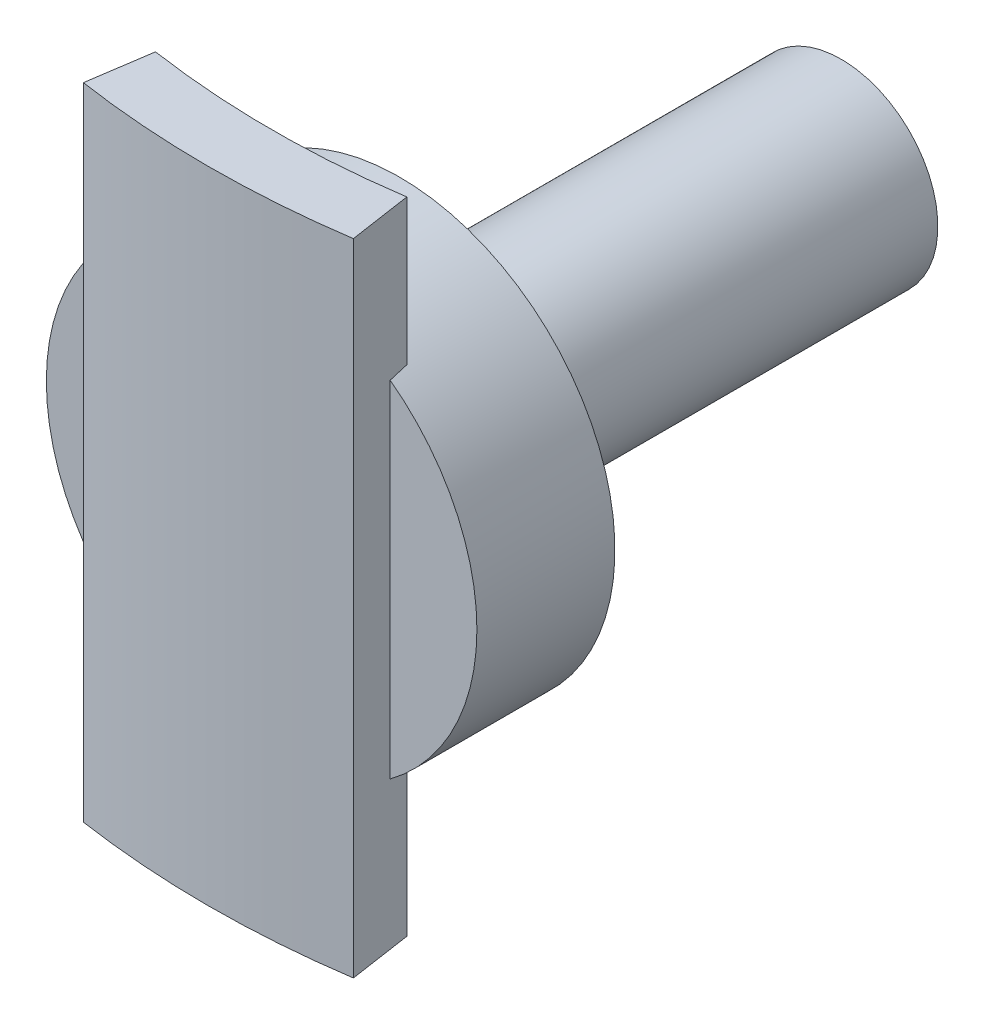
ISO-10303-21;
HEADER;
FILE_DESCRIPTION(('STEP AP214'),'2;1');
FILE_NAME('part.step','',(''),(''),'','','');
FILE_SCHEMA(('AUTOMOTIVE_DESIGN { 1 0 10303 214 1 1 1 1 }'));
ENDSEC;
DATA;
#1=APPLICATION_CONTEXT('core data for automotive mechanical design processes');
#2=APPLICATION_PROTOCOL_DEFINITION('international standard','automotive_design',2000,#1);
#3=PRODUCT_CONTEXT('',#1,'mechanical');
#4=PRODUCT('Part','Part','',(#3));
#5=PRODUCT_RELATED_PRODUCT_CATEGORY('part','',(#4));
#6=PRODUCT_DEFINITION_FORMATION('','',#4);
#7=PRODUCT_DEFINITION_CONTEXT('part definition',#1,'design');
#8=PRODUCT_DEFINITION('design','',#6,#7);
#9=PRODUCT_DEFINITION_SHAPE('','',#8);
#10=(LENGTH_UNIT() NAMED_UNIT(*) SI_UNIT(.MILLI.,.METRE.));
#11=(NAMED_UNIT(*) PLANE_ANGLE_UNIT() SI_UNIT($,.RADIAN.));
#12=(NAMED_UNIT(*) SI_UNIT($,.STERADIAN.) SOLID_ANGLE_UNIT());
#13=UNCERTAINTY_MEASURE_WITH_UNIT(LENGTH_MEASURE(1.E-05),#10,'distance_accuracy_value','');
#14=(GEOMETRIC_REPRESENTATION_CONTEXT(3) GLOBAL_UNCERTAINTY_ASSIGNED_CONTEXT((#13)) GLOBAL_UNIT_ASSIGNED_CONTEXT((#10,
#11,#12)) REPRESENTATION_CONTEXT('',''));
#15=CARTESIAN_POINT('',(0.,0.,0.));
#16=DIRECTION('',(0.,0.,1.));
#17=DIRECTION('',(1.,0.,0.));
#18=AXIS2_PLACEMENT_3D('',#15,#16,#17);
#19=CARTESIAN_POINT('',(0.,20.2,0.));
#20=DIRECTION('',(0.,-1.,0.));
#21=DIRECTION('',(0.,0.,-1.));
#22=AXIS2_PLACEMENT_3D('',#19,#20,#21);
#23=CYLINDRICAL_SURFACE('',#22,15.4);
#24=DIRECTION('',(0.,1.,0.));
#25=VECTOR('',#24,1.);
#26=CARTESIAN_POINT('',(-2.27626493139601,0.,15.2308442957735));
#27=LINE('',#26,#25);
#28=CARTESIAN_POINT('',(-2.27626493139601,21.9,15.2308442957735));
#29=VERTEX_POINT('',#28);
#30=CARTESIAN_POINT('',(-2.27626493139601,24.53320067543,15.2308442957735));
#31=VERTEX_POINT('',#30);
#32=EDGE_CURVE('E173',#29,#31,#27,.T.);
#33=ORIENTED_EDGE('',*,*,#32,.T.);
#34=CARTESIAN_POINT('',(-3.9,27.7,14.8979864411269));
#35=CARTESIAN_POINT('',(-3.89999405074988,27.4847386443197,14.8979904925009));
#36=CARTESIAN_POINT('',(-3.88211719420394,27.2694120222019,14.9027028737933));
#37=CARTESIAN_POINT('',(-3.81120018639779,26.844948940572,14.9209935374308));
#38=CARTESIAN_POINT('',(-3.7581401116938,26.6358160585698,14.9345768431095));
#39=CARTESIAN_POINT('',(-3.61868954621345,26.2299415941311,14.9689745230359));
#40=CARTESIAN_POINT('',(-3.53234280836113,26.033184138331,14.9897794014855));
#41=CARTESIAN_POINT('',(-3.32890398749788,25.6569247031427,15.0362641675388));
#42=CARTESIAN_POINT('',(-3.21181039035515,25.4774235741387,15.0619442952072));
#43=CARTESIAN_POINT('',(-2.94737744200514,25.136719763423,15.1159351982628));
#44=CARTESIAN_POINT('',(-2.79947072215102,24.9759641510205,15.1442888949249));
#45=CARTESIAN_POINT('',(-2.47883177445363,24.6812557943867,15.2000602125481));
#46=CARTESIAN_POINT('',(-2.30609718171597,24.5473056063256,15.2274777440296));
#47=CARTESIAN_POINT('',(-1.9376359377648,24.308174655996,15.2787631690267));
#48=CARTESIAN_POINT('',(-1.74161504775736,24.2034340881467,15.3025745099589));
#49=CARTESIAN_POINT('',(-1.33404464793704,24.0285593938372,15.3434744599586));
#50=CARTESIAN_POINT('',(-1.12249749667822,23.9584200236469,15.3605640876063));
#51=CARTESIAN_POINT('',(-0.69454145904559,23.8561735433245,15.3857916359705));
#52=CARTESIAN_POINT('',(-0.478324723144728,23.8233069864583,15.3941080583321));
#53=CARTESIAN_POINT('',(-0.0432972080128685,23.7941541883577,15.4014745886998));
#54=CARTESIAN_POINT('',(0.175513173050788,23.7978624031118,15.400526101083));
#55=CARTESIAN_POINT('',(0.604245976060564,23.841209843353,15.389602159303));
#56=CARTESIAN_POINT('',(0.814257334881429,23.8800291749485,15.3798326962527));
#57=CARTESIAN_POINT('',(1.2246823364494,23.9911777599147,15.3526049718664));
#58=CARTESIAN_POINT('',(1.42509546027114,24.0635088228346,15.3351462953349));
#59=CARTESIAN_POINT('',(1.81278229555946,24.2402843320468,15.2941885249762));
#60=CARTESIAN_POINT('',(1.99991795026964,24.3450184856472,15.2706352652444));
#61=CARTESIAN_POINT('',(2.35424352250207,24.5834069087999,15.2200399961182));
#62=CARTESIAN_POINT('',(2.52142988095994,24.7170663268469,15.1929973659868));
#63=CARTESIAN_POINT('',(2.83600167487867,25.0138983258875,15.1374815020119));
#64=CARTESIAN_POINT('',(2.98270868902013,25.1777871243347,15.1089893939195));
#65=CARTESIAN_POINT('',(3.24671079486308,25.5281386438389,15.0544708338493));
#66=CARTESIAN_POINT('',(3.3640044370201,25.7146024767635,15.0284445034288));
#67=CARTESIAN_POINT('',(3.56630001868724,26.1061683792964,14.9817351187305));
#68=CARTESIAN_POINT('',(3.65113465288917,26.3113604374552,14.9610799195554));
#69=CARTESIAN_POINT('',(3.7848904580346,26.7337445414732,14.9278064853642));
#70=CARTESIAN_POINT('',(3.83381954290839,26.9509339316497,14.9151864793951));
#71=CARTESIAN_POINT('',(3.89324141105126,27.3848457722709,14.8997850833352));
#72=CARTESIAN_POINT('',(3.90473897637376,27.60142165733,14.89674656723));
#73=CARTESIAN_POINT('',(3.89172557400846,28.0333985212429,14.9001516021188));
#74=CARTESIAN_POINT('',(3.8672180177936,28.2487996094676,14.9065942547753));
#75=CARTESIAN_POINT('',(3.78377198997728,28.6685548741622,14.9279889299675));
#76=CARTESIAN_POINT('',(3.72542211416739,28.8730341921413,14.9427953749247));
#77=CARTESIAN_POINT('',(3.57660213074529,29.2693082245034,14.979110346047));
#78=CARTESIAN_POINT('',(3.48612814213297,29.4611014029171,15.0006196819681));
#79=CARTESIAN_POINT('',(3.27353714960041,29.8308059955084,15.0484556458607));
#80=CARTESIAN_POINT('',(3.15082144738989,30.0083614963358,15.0748703021819));
#81=CARTESIAN_POINT('',(2.87798464227016,30.3407290401364,15.1293263785643));
#82=CARTESIAN_POINT('',(2.7278589126258,30.4955372354546,15.157368072719));
#83=CARTESIAN_POINT('',(2.39984535026828,30.7821050651483,15.212792679267));
#84=CARTESIAN_POINT('',(2.22134218194987,30.9131685450769,15.2401400341939));
#85=CARTESIAN_POINT('',(1.84427886167081,31.1434616482568,15.2903484248145));
#86=CARTESIAN_POINT('',(1.64571976317756,31.2426929423985,15.3132096959609));
#87=CARTESIAN_POINT('',(1.23556096144038,31.4056326721255,15.3517250720794));
#88=CARTESIAN_POINT('',(1.0240687921994,31.4695988848094,15.3674313271498));
#89=CARTESIAN_POINT('',(0.592885188223482,31.5609620273279,15.39009555411));
#90=CARTESIAN_POINT('',(0.373195388970059,31.5883662118538,15.3970552614868));
#91=CARTESIAN_POINT('',(-0.0616142891208617,31.6054104091632,15.4013692655055));
#92=CARTESIAN_POINT('',(-0.276691954980204,31.5960765773344,15.3989845754779));
#93=CARTESIAN_POINT('',(-0.702108813803498,31.5422662074745,15.3854587207122));
#94=CARTESIAN_POINT('',(-0.912448154272103,31.4977907649653,15.3743178289442));
#95=CARTESIAN_POINT('',(-1.32131292245911,31.3755159177255,15.344573953277));
#96=CARTESIAN_POINT('',(-1.51989843697458,31.2979064022439,15.3260135282613));
#97=CARTESIAN_POINT('',(-1.90134176252194,31.1117380610176,15.2833823416124));
#98=CARTESIAN_POINT('',(-2.08419754214271,31.0031752456073,15.2593108697224));
#99=CARTESIAN_POINT('',(-2.43383985293489,30.7550764774223,15.2075130223074));
#100=CARTESIAN_POINT('',(-2.60012334907585,30.6148472789297,15.1797115921676));
#101=CARTESIAN_POINT('',(-2.90714674517715,30.3087363507427,15.1239181596848));
#102=CARTESIAN_POINT('',(-3.04788011504073,30.1428480831147,15.0959261105147));
#103=CARTESIAN_POINT('',(-3.30247621077681,29.7862789812087,15.0423051313605));
#104=CARTESIAN_POINT('',(-3.41576866813952,29.5951818730165,15.016732155676));
#105=CARTESIAN_POINT('',(-3.60845133503208,29.1960322803163,14.9716044644346));
#106=CARTESIAN_POINT('',(-3.68786574544259,28.9879920261405,14.9520454555816));
#107=CARTESIAN_POINT('',(-3.79898414980237,28.6003256990468,14.9241528812492));
#108=CARTESIAN_POINT('',(-3.83678133594134,28.4225229908735,14.9144153421253));
#109=CARTESIAN_POINT('',(-3.88729063795742,28.0631621122496,14.9013307016354));
#110=CARTESIAN_POINT('',(-3.90000501905832,27.88160428242,14.8979830232033));
#111=CARTESIAN_POINT('',(-3.9,27.7,14.8979864411269));
#112=B_SPLINE_CURVE_WITH_KNOTS('',3,(#34,#35,#36,#37,#38,#39,#40,#41,#42,#43,#44,#45,#46,#47,
#48,#49,#50,#51,#52,#53,#54,#55,#56,#57,#58,#59,#60,#61,#62,#63,#64,#65,#66,#67,#68,#69,#70,#71,
#72,#73,#74,#75,#76,#77,#78,#79,#80,#81,#82,#83,#84,#85,#86,#87,#88,#89,#90,#91,#92,#93,#94,#95,
#96,#97,#98,#99,#100,#101,#102,#103,#104,#105,#106,#107,#108,#109,#110,#111),.UNSPECIFIED.,.T.,
.F.,(4,2,2,2,2,2,2,2,2,2,2,2,2,2,2,2,2,2,2,2,2,2,2,2,2,2,2,2,2,2,2,2,2,2,2,2,2,2,4),(0.,
0.645116995748467,1.29059961868836,1.93523667824213,2.57990548895997,3.23770238460948,
3.89556197803203,4.56285721310402,5.23005129006042,5.88339203353123,6.53663374500011,
7.17500436063681,7.81340945069614,8.45769587901236,9.10209708026288,9.76438488565063,
10.4267053233745,11.0923950275429,11.7579379631578,12.4054615668901,13.0529238219396,
13.6894492218671,14.3260515483133,14.9754319911195,15.6249221490184,16.2911368144357,
16.9573165041225,17.6185597765126,18.2796718245205,18.922450735056,19.5652096080759,
20.2043333003772,20.8435394085559,21.4983953200688,22.1534183646455,22.821068008592,
23.4882399131782,24.0325391465382,24.576789222078),.UNSPECIFIED.);
#113=CARTESIAN_POINT('',(2.27626493139601,24.53320067543,15.2308442957735));
#114=VERTEX_POINT('',#113);
#115=EDGE_CURVE('E57',#31,#114,#112,.T.);
#116=ORIENTED_EDGE('',*,*,#115,.T.);
#117=DIRECTION('',(0.,1.,0.));
#118=VECTOR('',#117,1.);
#119=CARTESIAN_POINT('',(2.27626493139601,0.,15.2308442957735));
#120=LINE('',#119,#118);
#121=CARTESIAN_POINT('',(2.27626493139601,21.9,15.2308442957735));
#122=VERTEX_POINT('',#121);
#123=EDGE_CURVE('E157',#122,#114,#120,.T.);
#124=ORIENTED_EDGE('',*,*,#123,.F.);
#125=CARTESIAN_POINT('',(0.,21.9,0.));
#126=DIRECTION('',(0.,-1.,0.));
#127=DIRECTION('',(0.,0.,-1.));
#128=AXIS2_PLACEMENT_3D('',#125,#126,#127);
#129=CIRCLE('',#128,15.4);
#130=EDGE_CURVE('E139',#122,#29,#129,.T.);
#131=ORIENTED_EDGE('',*,*,#130,.T.);
#132=EDGE_LOOP('',(#33,#116,#124,#131));
#133=FACE_BOUND('',#132,.T.);
#134=ADVANCED_FACE('F41',(#133),#23,.F.);
#135=CARTESIAN_POINT('',(0.,20.2,0.));
#136=DIRECTION('',(0.,-1.,0.));
#137=DIRECTION('',(0.,0.,-1.));
#138=AXIS2_PLACEMENT_3D('',#135,#136,#137);
#139=CYLINDRICAL_SURFACE('',#138,16.55);
#140=CARTESIAN_POINT('',(0.,21.9,0.));
#141=DIRECTION('',(0.,-1.,0.));
#142=DIRECTION('',(0.,0.,-1.));
#143=AXIS2_PLACEMENT_3D('',#140,#141,#142);
#144=CIRCLE('',#143,16.55);
#145=CARTESIAN_POINT('',(2.44624575419506,21.9,16.3682125386397));
#146=VERTEX_POINT('',#145);
#147=CARTESIAN_POINT('',(-2.44624575419506,21.9,16.3682125386397));
#148=VERTEX_POINT('',#147);
#149=EDGE_CURVE('E135',#146,#148,#144,.T.);
#150=ORIENTED_EDGE('',*,*,#149,.F.);
#151=DIRECTION('',(0.,-1.,0.));
#152=VECTOR('',#151,1.);
#153=CARTESIAN_POINT('',(2.44624575419506,0.,16.3682125386397));
#154=LINE('',#153,#152);
#155=CARTESIAN_POINT('',(2.44624575419506,33.5,16.3682125386397));
#156=VERTEX_POINT('',#155);
#157=EDGE_CURVE('E166',#156,#146,#154,.T.);
#158=ORIENTED_EDGE('',*,*,#157,.F.);
#159=CARTESIAN_POINT('',(0.,33.5,0.));
#160=DIRECTION('',(0.,-1.,0.));
#161=DIRECTION('',(0.,0.,-1.));
#162=AXIS2_PLACEMENT_3D('',#159,#160,#161);
#163=CIRCLE('',#162,16.55);
#164=CARTESIAN_POINT('',(-2.44624575419506,33.5,16.3682125386397));
#165=VERTEX_POINT('',#164);
#166=EDGE_CURVE('E65',#156,#165,#163,.T.);
#167=ORIENTED_EDGE('',*,*,#166,.T.);
#168=DIRECTION('',(0.,-1.,0.));
#169=VECTOR('',#168,1.);
#170=CARTESIAN_POINT('',(-2.44624575419506,0.,16.3682125386397));
#171=LINE('',#170,#169);
#172=EDGE_CURVE('E179',#165,#148,#171,.T.);
#173=ORIENTED_EDGE('',*,*,#172,.T.);
#174=EDGE_LOOP('',(#150,#158,#167,#173));
#175=FACE_BOUND('',#174,.T.);
#176=ADVANCED_FACE('F217',(#175),#139,.T.);
#177=CARTESIAN_POINT('',(0.,21.9,0.));
#178=DIRECTION('',(0.,1.,0.));
#179=DIRECTION('',(0.,0.,1.));
#180=AXIS2_PLACEMENT_3D('',#177,#178,#179);
#181=PLANE('',#180);
#182=ORIENTED_EDGE('',*,*,#130,.F.);
#183=DIRECTION('',(-0.147809411129611,0.,-0.989015863361917));
#184=VECTOR('',#183,1.);
#185=CARTESIAN_POINT('',(0.,21.9,0.));
#186=LINE('',#185,#184);
#187=EDGE_CURVE('E162',#146,#122,#186,.T.);
#188=ORIENTED_EDGE('',*,*,#187,.F.);
#189=ORIENTED_EDGE('',*,*,#149,.T.);
#190=DIRECTION('',(0.147809411129611,0.,-0.989015863361917));
#191=VECTOR('',#190,1.);
#192=CARTESIAN_POINT('',(0.,21.9,0.));
#193=LINE('',#192,#191);
#194=EDGE_CURVE('E176',#148,#29,#193,.T.);
#195=ORIENTED_EDGE('',*,*,#194,.T.);
#196=EDGE_LOOP('',(#182,#188,#189,#195));
#197=FACE_BOUND('',#196,.T.);
#198=ADVANCED_FACE('F219',(#197),#181,.F.);
#199=CARTESIAN_POINT('',(2.27626493139601,30.8667993245699,15.2308442957735));
#200=VERTEX_POINT('',#199);
#201=CARTESIAN_POINT('',(2.27626493139601,33.5,15.2308442957735));
#202=VERTEX_POINT('',#201);
#203=EDGE_CURVE('E161',#200,#202,#120,.T.);
#204=ORIENTED_EDGE('',*,*,#203,.F.);
#205=CARTESIAN_POINT('',(-2.27626493139601,30.8667993245699,15.2308442957735));
#206=VERTEX_POINT('',#205);
#207=EDGE_CURVE('E189',#200,#206,#112,.T.);
#208=ORIENTED_EDGE('',*,*,#207,.T.);
#209=CARTESIAN_POINT('',(-2.27626493139601,33.5,15.2308442957735));
#210=VERTEX_POINT('',#209);
#211=EDGE_CURVE('E128',#206,#210,#27,.T.);
#212=ORIENTED_EDGE('',*,*,#211,.T.);
#213=CARTESIAN_POINT('',(0.,33.5,0.));
#214=DIRECTION('',(0.,-1.,0.));
#215=DIRECTION('',(0.,0.,-1.));
#216=AXIS2_PLACEMENT_3D('',#213,#214,#215);
#217=CIRCLE('',#216,15.4);
#218=EDGE_CURVE('E145',#202,#210,#217,.T.);
#219=ORIENTED_EDGE('',*,*,#218,.F.);
#220=EDGE_LOOP('',(#204,#208,#212,#219));
#221=FACE_BOUND('',#220,.T.);
#222=ADVANCED_FACE('F197',(#221),#23,.F.);
#223=CARTESIAN_POINT('',(0.,33.5,0.));
#224=DIRECTION('',(0.,-1.,0.));
#225=DIRECTION('',(0.,0.,-1.));
#226=AXIS2_PLACEMENT_3D('',#223,#224,#225);
#227=PLANE('',#226);
#228=DIRECTION('',(0.147809411129611,0.,0.989015863361917));
#229=VECTOR('',#228,1.);
#230=CARTESIAN_POINT('',(0.,33.5,0.));
#231=LINE('',#230,#229);
#232=EDGE_CURVE('E153',#202,#156,#231,.T.);
#233=ORIENTED_EDGE('',*,*,#232,.F.);
#234=ORIENTED_EDGE('',*,*,#218,.T.);
#235=DIRECTION('',(-0.147809411129611,0.,0.989015863361917));
#236=VECTOR('',#235,1.);
#237=CARTESIAN_POINT('',(0.,33.5,0.));
#238=LINE('',#237,#236);
#239=EDGE_CURVE('E170',#210,#165,#238,.T.);
#240=ORIENTED_EDGE('',*,*,#239,.T.);
#241=ORIENTED_EDGE('',*,*,#166,.F.);
#242=EDGE_LOOP('',(#233,#234,#240,#241));
#243=FACE_BOUND('',#242,.T.);
#244=ADVANCED_FACE('F215',(#243),#227,.F.);
#245=CARTESIAN_POINT('',(0.,0.,0.));
#246=DIRECTION('',(0.989015863361917,0.,-0.147809411129611));
#247=DIRECTION('',(-0.147809411129611,0.,-0.989015863361917));
#248=AXIS2_PLACEMENT_3D('',#245,#246,#247);
#249=PLANE('',#248);
#250=CARTESIAN_POINT('',(0.,27.7,0.));
#251=DIRECTION('',(0.989015863361917,0.,-0.147809411129611));
#252=DIRECTION('',(-0.147809411129611,0.,-0.989015863361917));
#253=AXIS2_PLACEMENT_3D('',#250,#251,#252);
#254=ELLIPSE('',#253,26.3853293927284,3.9);
#255=CARTESIAN_POINT('',(2.32913148884074,30.8281218818471,15.5845826914182));
#256=VERTEX_POINT('',#255);
#257=EDGE_CURVE('E185',#200,#256,#254,.T.);
#258=ORIENTED_EDGE('',*,*,#257,.F.);
#259=ORIENTED_EDGE('',*,*,#203,.T.);
#260=ORIENTED_EDGE('',*,*,#232,.T.);
#261=ORIENTED_EDGE('',*,*,#157,.T.);
#262=ORIENTED_EDGE('',*,*,#187,.T.);
#263=ORIENTED_EDGE('',*,*,#123,.T.);
#264=CARTESIAN_POINT('',(2.32913148884074,24.5718781181529,15.5845826914182));
#265=VERTEX_POINT('',#264);
#266=EDGE_CURVE('E186',#265,#114,#254,.T.);
#267=ORIENTED_EDGE('',*,*,#266,.F.);
#268=DIRECTION('',(0.,-1.,0.));
#269=VECTOR('',#268,1.);
#270=CARTESIAN_POINT('',(2.32913148884074,0.,15.5845826914182));
#271=LINE('',#270,#269);
#272=EDGE_CURVE('E182',#256,#265,#271,.T.);
#273=ORIENTED_EDGE('',*,*,#272,.F.);
#274=EDGE_LOOP('',(#258,#259,#260,#261,#262,#263,#267,#273));
#275=FACE_BOUND('',#274,.T.);
#276=ADVANCED_FACE('F212',(#275),#249,.T.);
#277=CARTESIAN_POINT('',(0.,0.,0.));
#278=DIRECTION('',(0.989015863361917,0.,0.147809411129611));
#279=DIRECTION('',(0.147809411129611,0.,-0.989015863361917));
#280=AXIS2_PLACEMENT_3D('',#277,#278,#279);
#281=PLANE('',#280);
#282=ORIENTED_EDGE('',*,*,#211,.F.);
#283=CARTESIAN_POINT('',(0.,27.7,0.));
#284=DIRECTION('',(0.989015863361917,0.,0.147809411129611));
#285=DIRECTION('',(0.147809411129611,0.,-0.989015863361917));
#286=AXIS2_PLACEMENT_3D('',#283,#284,#285);
#287=ELLIPSE('',#286,26.3853293927284,3.9);
#288=CARTESIAN_POINT('',(-2.32913148884074,30.8281218818471,15.5845826914182));
#289=VERTEX_POINT('',#288);
#290=EDGE_CURVE('E115',#206,#289,#287,.T.);
#291=ORIENTED_EDGE('',*,*,#290,.T.);
#292=DIRECTION('',(0.,-1.,0.));
#293=VECTOR('',#292,1.);
#294=CARTESIAN_POINT('',(-2.32913148884074,0.,15.5845826914182));
#295=LINE('',#294,#293);
#296=CARTESIAN_POINT('',(-2.32913148884074,24.5718781181529,15.5845826914182));
#297=VERTEX_POINT('',#296);
#298=EDGE_CURVE('E108',#289,#297,#295,.T.);
#299=ORIENTED_EDGE('',*,*,#298,.T.);
#300=EDGE_CURVE('E116',#297,#31,#287,.T.);
#301=ORIENTED_EDGE('',*,*,#300,.T.);
#302=ORIENTED_EDGE('',*,*,#32,.F.);
#303=ORIENTED_EDGE('',*,*,#194,.F.);
#304=ORIENTED_EDGE('',*,*,#172,.F.);
#305=ORIENTED_EDGE('',*,*,#239,.F.);
#306=EDGE_LOOP('',(#282,#291,#299,#301,#302,#303,#304,#305));
#307=FACE_BOUND('',#306,.T.);
#308=ADVANCED_FACE('F126',(#307),#281,.F.);
#309=CARTESIAN_POINT('',(0.,27.7,15.5845826914182));
#310=DIRECTION('',(0.,0.,1.));
#311=DIRECTION('',(1.,0.,0.));
#312=AXIS2_PLACEMENT_3D('',#309,#310,#311);
#313=PLANE('',#312);
#314=ORIENTED_EDGE('',*,*,#298,.F.);
#315=CARTESIAN_POINT('',(0.,27.7,15.5845826914182));
#316=DIRECTION('',(0.,0.,-1.));
#317=DIRECTION('',(-1.,0.,0.));
#318=AXIS2_PLACEMENT_3D('',#315,#316,#317);
#319=CIRCLE('',#318,3.9);
#320=EDGE_CURVE('E111',#297,#289,#319,.T.);
#321=ORIENTED_EDGE('',*,*,#320,.F.);
#322=EDGE_LOOP('',(#314,#321));
#323=FACE_BOUND('',#322,.T.);
#324=ADVANCED_FACE('F110',(#323),#313,.T.);
#325=EDGE_CURVE('E122',#256,#265,#319,.T.);
#326=ORIENTED_EDGE('',*,*,#325,.F.);
#327=ORIENTED_EDGE('',*,*,#272,.T.);
#328=EDGE_LOOP('',(#326,#327));
#329=FACE_BOUND('',#328,.T.);
#330=ADVANCED_FACE('F205',(#329),#313,.T.);
#331=CARTESIAN_POINT('',(0.,27.7,13.0845826914182));
#332=DIRECTION('',(0.,0.,-1.));
#333=DIRECTION('',(-1.,0.,0.));
#334=AXIS2_PLACEMENT_3D('',#331,#332,#333);
#335=CYLINDRICAL_SURFACE('',#334,3.9);
#336=ORIENTED_EDGE('',*,*,#207,.F.);
#337=ORIENTED_EDGE('',*,*,#257,.T.);
#338=ORIENTED_EDGE('',*,*,#325,.T.);
#339=ORIENTED_EDGE('',*,*,#266,.T.);
#340=ORIENTED_EDGE('',*,*,#115,.F.);
#341=ORIENTED_EDGE('',*,*,#300,.F.);
#342=ORIENTED_EDGE('',*,*,#320,.T.);
#343=ORIENTED_EDGE('',*,*,#290,.F.);
#344=EDGE_LOOP('',(#336,#337,#338,#339,#340,#341,#342,#343));
#345=FACE_BOUND('',#344,.T.);
#346=CARTESIAN_POINT('',(0.,27.7,13.0845826914182));
#347=DIRECTION('',(0.,0.,-1.));
#348=DIRECTION('',(-1.,0.,0.));
#349=AXIS2_PLACEMENT_3D('',#346,#347,#348);
#350=CIRCLE('',#349,3.9);
#351=CARTESIAN_POINT('',(-3.9,27.7,13.0845826914182));
#352=VERTEX_POINT('',#351);
#353=EDGE_CURVE('E123',#352,#352,#350,.T.);
#354=ORIENTED_EDGE('',*,*,#353,.F.);
#355=EDGE_LOOP('',(#354));
#356=FACE_BOUND('',#355,.T.);
#357=ADVANCED_FACE('F118',(#345,#356),#335,.T.);
#358=CARTESIAN_POINT('',(0.,31.6,13.0845826914182));
#359=DIRECTION('',(0.,0.,-1.));
#360=DIRECTION('',(-1.,0.,0.));
#361=AXIS2_PLACEMENT_3D('',#358,#359,#360);
#362=PLANE('',#361);
#363=CARTESIAN_POINT('',(0.,27.7,13.0845826914182));
#364=DIRECTION('',(0.,0.,-1.));
#365=DIRECTION('',(-1.,0.,0.));
#366=AXIS2_PLACEMENT_3D('',#363,#364,#365);
#367=CIRCLE('',#366,2.75);
#368=CARTESIAN_POINT('',(-2.75,27.7,13.0845826914182));
#369=VERTEX_POINT('',#368);
#370=EDGE_CURVE('E11',#369,#369,#367,.F.);
#371=ORIENTED_EDGE('',*,*,#370,.T.);
#372=EDGE_LOOP('',(#371));
#373=FACE_BOUND('',#372,.T.);
#374=ORIENTED_EDGE('',*,*,#353,.T.);
#375=EDGE_LOOP('',(#374));
#376=FACE_BOUND('',#375,.T.);
#377=ADVANCED_FACE('F204',(#373,#376),#362,.T.);
#378=CARTESIAN_POINT('',(0.,27.7,5.0845826914182));
#379=DIRECTION('',(0.,0.,1.));
#380=DIRECTION('',(1.,0.,0.));
#381=AXIS2_PLACEMENT_3D('',#378,#379,#380);
#382=CYLINDRICAL_SURFACE('',#381,1.75);
#383=CARTESIAN_POINT('',(0.,27.7,12.0845826914182));
#384=DIRECTION('',(0.,0.,-1.));
#385=DIRECTION('',(-1.,0.,0.));
#386=AXIS2_PLACEMENT_3D('',#383,#384,#385);
#387=CIRCLE('',#386,1.75);
#388=CARTESIAN_POINT('',(-1.75,27.7,12.0845826914182));
#389=VERTEX_POINT('',#388);
#390=EDGE_CURVE('E50',#389,#389,#387,.T.);
#391=ORIENTED_EDGE('',*,*,#390,.T.);
#392=EDGE_LOOP('',(#391));
#393=FACE_BOUND('',#392,.T.);
#394=CARTESIAN_POINT('',(0.,27.7,5.0845826914182));
#395=DIRECTION('',(0.,0.,-1.));
#396=DIRECTION('',(-1.,0.,0.));
#397=AXIS2_PLACEMENT_3D('',#394,#395,#396);
#398=CIRCLE('',#397,1.75);
#399=CARTESIAN_POINT('',(-1.75,27.7,5.0845826914182));
#400=VERTEX_POINT('',#399);
#401=EDGE_CURVE('E245',#400,#400,#398,.T.);
#402=ORIENTED_EDGE('',*,*,#401,.F.);
#403=EDGE_LOOP('',(#402));
#404=FACE_BOUND('',#403,.T.);
#405=ADVANCED_FACE('F252',(#393,#404),#382,.T.);
#406=CARTESIAN_POINT('',(0.,27.7,5.0845826914182));
#407=DIRECTION('',(0.,0.,-1.));
#408=DIRECTION('',(-1.,0.,0.));
#409=AXIS2_PLACEMENT_3D('',#406,#407,#408);
#410=PLANE('',#409);
#411=ORIENTED_EDGE('',*,*,#401,.T.);
#412=EDGE_LOOP('',(#411));
#413=FACE_BOUND('',#412,.T.);
#414=ADVANCED_FACE('F250',(#413),#410,.T.);
#415=CARTESIAN_POINT('',(0.,27.7,12.0845826914182));
#416=DIRECTION('',(0.,0.,-1.));
#417=DIRECTION('',(-1.,0.,0.));
#418=AXIS2_PLACEMENT_3D('',#415,#416,#417);
#419=TOROIDAL_SURFACE('',#418,2.75,1.);
#420=ORIENTED_EDGE('',*,*,#370,.F.);
#421=EDGE_LOOP('',(#420));
#422=FACE_BOUND('',#421,.T.);
#423=ORIENTED_EDGE('',*,*,#390,.F.);
#424=EDGE_LOOP('',(#423));
#425=FACE_BOUND('',#424,.T.);
#426=ADVANCED_FACE('F43',(#422,#425),#419,.F.);
#427=CLOSED_SHELL('',(#134,#176,#198,#222,#244,#276,#308,#324,#330,#357,#377,#405,#414,#426));
#428=MANIFOLD_SOLID_BREP('B2',#427);
#429=ADVANCED_BREP_SHAPE_REPRESENTATION('',(#18,#428),#14);
#430=SHAPE_DEFINITION_REPRESENTATION(#9,#429);
ENDSEC;
END-ISO-10303-21;
